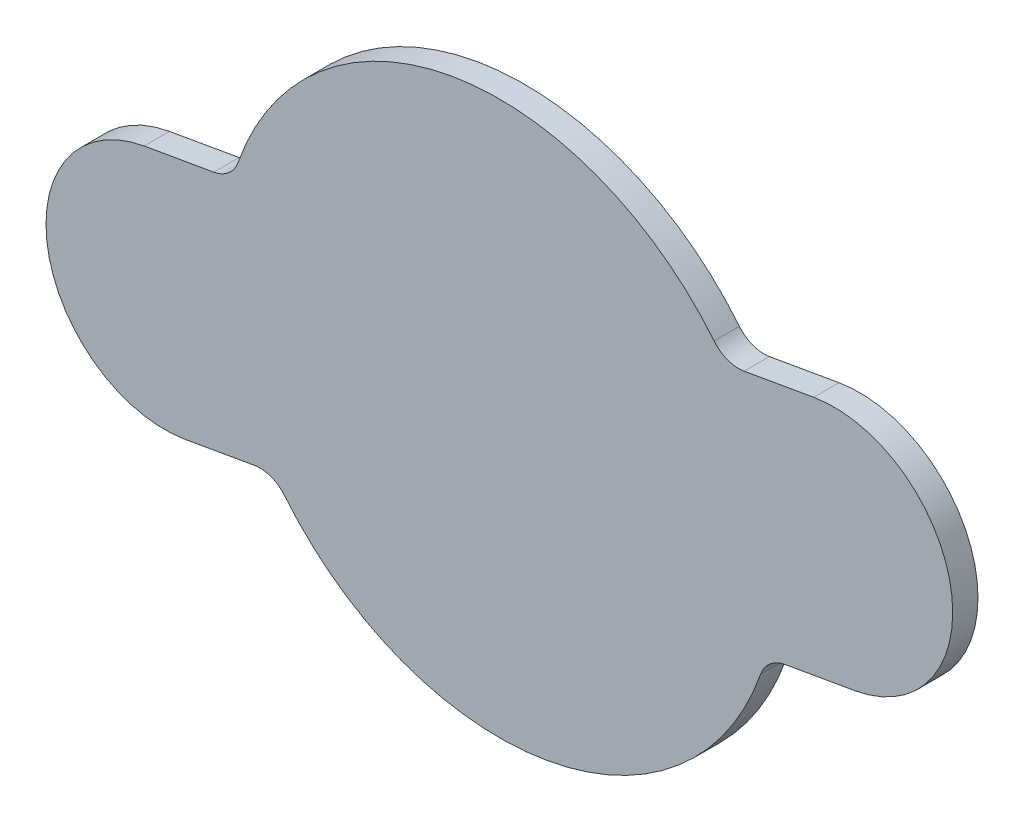
ISO-10303-21;
HEADER;
FILE_DESCRIPTION(('STEP AP214'),'2;1');
FILE_NAME('part.step','',(''),(''),'','','');
FILE_SCHEMA(('AUTOMOTIVE_DESIGN { 1 0 10303 214 1 1 1 1 }'));
ENDSEC;
DATA;
#1=APPLICATION_CONTEXT('core data for automotive mechanical design processes');
#2=APPLICATION_PROTOCOL_DEFINITION('international standard','automotive_design',2000,#1);
#3=PRODUCT_CONTEXT('',#1,'mechanical');
#4=PRODUCT('Part','Part','',(#3));
#5=PRODUCT_RELATED_PRODUCT_CATEGORY('part','',(#4));
#6=PRODUCT_DEFINITION_FORMATION('','',#4);
#7=PRODUCT_DEFINITION_CONTEXT('part definition',#1,'design');
#8=PRODUCT_DEFINITION('design','',#6,#7);
#9=PRODUCT_DEFINITION_SHAPE('','',#8);
#10=(LENGTH_UNIT() NAMED_UNIT(*) SI_UNIT(.MILLI.,.METRE.));
#11=(NAMED_UNIT(*) PLANE_ANGLE_UNIT() SI_UNIT($,.RADIAN.));
#12=(NAMED_UNIT(*) SI_UNIT($,.STERADIAN.) SOLID_ANGLE_UNIT());
#13=UNCERTAINTY_MEASURE_WITH_UNIT(LENGTH_MEASURE(1.E-05),#10,'distance_accuracy_value','');
#14=(GEOMETRIC_REPRESENTATION_CONTEXT(3) GLOBAL_UNCERTAINTY_ASSIGNED_CONTEXT((#13)) GLOBAL_UNIT_ASSIGNED_CONTEXT((#10,
#11,#12)) REPRESENTATION_CONTEXT('',''));
#15=CARTESIAN_POINT('',(0.,0.,0.));
#16=DIRECTION('',(0.,0.,1.));
#17=DIRECTION('',(1.,0.,0.));
#18=AXIS2_PLACEMENT_3D('',#15,#16,#17);
#19=CARTESIAN_POINT('',(18.8794931820799,-5.07061982227756,1.6));
#20=DIRECTION('',(0.,0.,-1.));
#21=DIRECTION('',(-1.,0.,0.));
#22=AXIS2_PLACEMENT_3D('',#19,#20,#21);
#23=CYLINDRICAL_SURFACE('',#22,2.);
#24=CARTESIAN_POINT('',(18.8794931820799,-5.07061982227756,0.));
#25=DIRECTION('',(0.,0.,-1.));
#26=DIRECTION('',(1.,0.,0.));
#27=AXIS2_PLACEMENT_3D('',#24,#25,#26);
#28=CIRCLE('',#27,2.);
#29=CARTESIAN_POINT('',(16.9910803574148,-4.41191123447826,0.));
#30=VERTEX_POINT('',#29);
#31=CARTESIAN_POINT('',(18.5347486287399,-3.10055606875525,0.));
#32=VERTEX_POINT('',#31);
#33=EDGE_CURVE('E153',#30,#32,#28,.T.);
#34=ORIENTED_EDGE('',*,*,#33,.T.);
#35=DIRECTION('',(0.,0.,-1.));
#36=VECTOR('',#35,1.);
#37=CARTESIAN_POINT('',(18.5347486287399,-3.10055606875525,1.6));
#38=LINE('',#37,#36);
#39=CARTESIAN_POINT('',(18.5347486287399,-3.10055606875525,1.6));
#40=VERTEX_POINT('',#39);
#41=EDGE_CURVE('E11',#40,#32,#38,.T.);
#42=ORIENTED_EDGE('',*,*,#41,.F.);
#43=CARTESIAN_POINT('',(18.8794931820799,-5.07061982227756,1.6));
#44=DIRECTION('',(0.,0.,-1.));
#45=DIRECTION('',(1.,0.,0.));
#46=AXIS2_PLACEMENT_3D('',#43,#44,#45);
#47=CIRCLE('',#46,2.);
#48=CARTESIAN_POINT('',(16.9910803574148,-4.41191123447826,1.6));
#49=VERTEX_POINT('',#48);
#50=EDGE_CURVE('E175',#49,#40,#47,.T.);
#51=ORIENTED_EDGE('',*,*,#50,.F.);
#52=DIRECTION('',(0.,0.,-1.));
#53=VECTOR('',#52,1.);
#54=CARTESIAN_POINT('',(16.9910803574148,-4.41191123447826,1.6));
#55=LINE('',#54,#53);
#56=EDGE_CURVE('E149',#49,#30,#55,.T.);
#57=ORIENTED_EDGE('',*,*,#56,.T.);
#58=EDGE_LOOP('',(#34,#42,#51,#57));
#59=FACE_BOUND('',#58,.T.);
#60=ADVANCED_FACE('F33',(#59),#23,.F.);
#61=CARTESIAN_POINT('',(18.5347486287399,-3.10055606875525,1.6));
#62=DIRECTION('',(-0.172372276669998,0.985031876761154,0.));
#63=DIRECTION('',(-0.985031876761154,-0.172372276669998,0.));
#64=AXIS2_PLACEMENT_3D('',#61,#62,#63);
#65=PLANE('',#64);
#66=DIRECTION('',(0.985031876761154,0.172372276669998,0.));
#67=VECTOR('',#66,1.);
#68=CARTESIAN_POINT('',(18.5347486287399,-3.10055606875525,0.));
#69=LINE('',#68,#67);
#70=CARTESIAN_POINT('',(22.9384455669854,-2.32994621853805,0.));
#71=VERTEX_POINT('',#70);
#72=EDGE_CURVE('E156',#32,#71,#69,.T.);
#73=ORIENTED_EDGE('',*,*,#72,.T.);
#74=DIRECTION('',(0.,0.,-1.));
#75=VECTOR('',#74,1.);
#76=CARTESIAN_POINT('',(22.9384455669854,-2.32994621853805,1.6));
#77=LINE('',#76,#75);
#78=CARTESIAN_POINT('',(22.9384455669854,-2.32994621853805,1.6));
#79=VERTEX_POINT('',#78);
#80=EDGE_CURVE('E41',#79,#71,#77,.T.);
#81=ORIENTED_EDGE('',*,*,#80,.F.);
#82=DIRECTION('',(0.985031876761154,0.172372276669998,0.));
#83=VECTOR('',#82,1.);
#84=CARTESIAN_POINT('',(18.5347486287399,-3.10055606875525,1.6));
#85=LINE('',#84,#83);
#86=EDGE_CURVE('E104',#40,#79,#85,.T.);
#87=ORIENTED_EDGE('',*,*,#86,.F.);
#88=ORIENTED_EDGE('',*,*,#41,.T.);
#89=EDGE_LOOP('',(#73,#81,#87,#88));
#90=FACE_BOUND('',#89,.T.);
#91=ADVANCED_FACE('F253',(#90),#65,.F.);
#92=CARTESIAN_POINT('',(21.6456534919604,5.05779285717059,1.6));
#93=DIRECTION('',(0.,0.,-1.));
#94=DIRECTION('',(-1.,0.,0.));
#95=AXIS2_PLACEMENT_3D('',#92,#93,#94);
#96=CYLINDRICAL_SURFACE('',#95,7.49999999999999);
#97=CARTESIAN_POINT('',(21.6456534919604,5.05779285717059,0.));
#98=DIRECTION('',(0.,0.,1.));
#99=DIRECTION('',(1.,0.,0.));
#100=AXIS2_PLACEMENT_3D('',#97,#98,#99);
#101=CIRCLE('',#100,7.49999999999999);
#102=CARTESIAN_POINT('',(20.3528614169354,12.4455319328792,0.));
#103=VERTEX_POINT('',#102);
#104=EDGE_CURVE('E158',#71,#103,#101,.T.);
#105=ORIENTED_EDGE('',*,*,#104,.T.);
#106=DIRECTION('',(0.,0.,-1.));
#107=VECTOR('',#106,1.);
#108=CARTESIAN_POINT('',(20.3528614169354,12.4455319328792,1.6));
#109=LINE('',#108,#107);
#110=CARTESIAN_POINT('',(20.3528614169354,12.4455319328792,1.6));
#111=VERTEX_POINT('',#110);
#112=EDGE_CURVE('E194',#111,#103,#109,.T.);
#113=ORIENTED_EDGE('',*,*,#112,.F.);
#114=CARTESIAN_POINT('',(21.6456534919604,5.05779285717059,1.6));
#115=DIRECTION('',(0.,0.,1.));
#116=DIRECTION('',(1.,0.,0.));
#117=AXIS2_PLACEMENT_3D('',#114,#115,#116);
#118=CIRCLE('',#117,7.49999999999999);
#119=EDGE_CURVE('E202',#79,#111,#118,.T.);
#120=ORIENTED_EDGE('',*,*,#119,.F.);
#121=ORIENTED_EDGE('',*,*,#80,.T.);
#122=EDGE_LOOP('',(#105,#113,#120,#121));
#123=FACE_BOUND('',#122,.T.);
#124=ADVANCED_FACE('F200',(#123),#96,.T.);
#125=CARTESIAN_POINT('',(15.9491644786899,11.6749220826621,1.6));
#126=DIRECTION('',(0.172372276669998,-0.985031876761154,0.));
#127=DIRECTION('',(0.985031876761154,0.172372276669998,0.));
#128=AXIS2_PLACEMENT_3D('',#125,#126,#127);
#129=PLANE('',#128);
#130=DIRECTION('',(-0.985031876761154,-0.172372276669998,0.));
#131=VECTOR('',#130,1.);
#132=CARTESIAN_POINT('',(15.9491644786899,11.6749220826621,0.));
#133=LINE('',#132,#131);
#134=CARTESIAN_POINT('',(15.9491644786899,11.6749220826621,0.));
#135=VERTEX_POINT('',#134);
#136=EDGE_CURVE('E160',#103,#135,#133,.T.);
#137=ORIENTED_EDGE('',*,*,#136,.T.);
#138=DIRECTION('',(0.,0.,-1.));
#139=VECTOR('',#138,1.);
#140=CARTESIAN_POINT('',(15.9491644786899,11.6749220826621,1.6));
#141=LINE('',#140,#139);
#142=CARTESIAN_POINT('',(15.9491644786899,11.6749220826621,1.6));
#143=VERTEX_POINT('',#142);
#144=EDGE_CURVE('E191',#143,#135,#141,.T.);
#145=ORIENTED_EDGE('',*,*,#144,.F.);
#146=DIRECTION('',(-0.985031876761154,-0.172372276669998,0.));
#147=VECTOR('',#146,1.);
#148=CARTESIAN_POINT('',(15.9491644786899,11.6749220826621,1.6));
#149=LINE('',#148,#147);
#150=EDGE_CURVE('E220',#111,#143,#149,.T.);
#151=ORIENTED_EDGE('',*,*,#150,.F.);
#152=ORIENTED_EDGE('',*,*,#112,.T.);
#153=EDGE_LOOP('',(#137,#145,#151,#152));
#154=FACE_BOUND('',#153,.T.);
#155=ADVANCED_FACE('F211',(#154),#129,.F.);
#156=CARTESIAN_POINT('',(15.6044199253499,13.6449858361844,1.6));
#157=DIRECTION('',(0.,0.,-1.));
#158=DIRECTION('',(-1.,0.,0.));
#159=AXIS2_PLACEMENT_3D('',#156,#157,#158);
#160=CYLINDRICAL_SURFACE('',#159,2.);
#161=CARTESIAN_POINT('',(15.6044199253499,13.6449858361844,0.));
#162=DIRECTION('',(0.,0.,-1.));
#163=DIRECTION('',(1.,0.,0.));
#164=AXIS2_PLACEMENT_3D('',#161,#162,#163);
#165=CIRCLE('',#164,2.);
#166=CARTESIAN_POINT('',(14.0519120500931,12.3841451256799,0.));
#167=VERTEX_POINT('',#166);
#168=EDGE_CURVE('E162',#135,#167,#165,.T.);
#169=ORIENTED_EDGE('',*,*,#168,.T.);
#170=DIRECTION('',(0.,0.,-1.));
#171=VECTOR('',#170,1.);
#172=CARTESIAN_POINT('',(14.0519120500931,12.3841451256799,1.6));
#173=LINE('',#172,#171);
#174=CARTESIAN_POINT('',(14.0519120500931,12.3841451256799,1.6));
#175=VERTEX_POINT('',#174);
#176=EDGE_CURVE('E188',#175,#167,#173,.T.);
#177=ORIENTED_EDGE('',*,*,#176,.F.);
#178=CARTESIAN_POINT('',(15.6044199253499,13.6449858361844,1.6));
#179=DIRECTION('',(0.,0.,-1.));
#180=DIRECTION('',(1.,0.,0.));
#181=AXIS2_PLACEMENT_3D('',#178,#179,#180);
#182=CIRCLE('',#181,2.);
#183=EDGE_CURVE('E217',#143,#175,#182,.T.);
#184=ORIENTED_EDGE('',*,*,#183,.F.);
#185=ORIENTED_EDGE('',*,*,#144,.T.);
#186=EDGE_LOOP('',(#169,#177,#184,#185));
#187=FACE_BOUND('',#186,.T.);
#188=ADVANCED_FACE('F215',(#187),#160,.F.);
#189=CARTESIAN_POINT('',(0.467468141595605,1.35178890876565,1.6));
#190=DIRECTION('',(0.,0.,-1.));
#191=DIRECTION('',(-1.,0.,0.));
#192=AXIS2_PLACEMENT_3D('',#189,#190,#191);
#193=CYLINDRICAL_SURFACE('',#192,17.5);
#194=CARTESIAN_POINT('',(0.467468141595605,1.35178890876565,0.));
#195=DIRECTION('',(0.,0.,1.));
#196=DIRECTION('',(1.,0.,0.));
#197=AXIS2_PLACEMENT_3D('',#194,#195,#196);
#198=CIRCLE('',#197,17.5);
#199=CARTESIAN_POINT('',(-16.0561440742236,7.11548905200956,0.));
#200=VERTEX_POINT('',#199);
#201=EDGE_CURVE('E164',#167,#200,#198,.T.);
#202=ORIENTED_EDGE('',*,*,#201,.T.);
#203=DIRECTION('',(0.,0.,-1.));
#204=VECTOR('',#203,1.);
#205=CARTESIAN_POINT('',(-16.0561440742236,7.11548905200956,1.6));
#206=LINE('',#205,#204);
#207=CARTESIAN_POINT('',(-16.0561440742236,7.11548905200956,1.6));
#208=VERTEX_POINT('',#207);
#209=EDGE_CURVE('E185',#208,#200,#206,.T.);
#210=ORIENTED_EDGE('',*,*,#209,.F.);
#211=CARTESIAN_POINT('',(0.467468141595605,1.35178890876565,1.6));
#212=DIRECTION('',(0.,0.,1.));
#213=DIRECTION('',(1.,0.,0.));
#214=AXIS2_PLACEMENT_3D('',#211,#212,#213);
#215=CIRCLE('',#214,17.5);
#216=EDGE_CURVE('E219',#175,#208,#215,.T.);
#217=ORIENTED_EDGE('',*,*,#216,.F.);
#218=ORIENTED_EDGE('',*,*,#176,.T.);
#219=EDGE_LOOP('',(#202,#210,#217,#218));
#220=FACE_BOUND('',#219,.T.);
#221=ADVANCED_FACE('F266',(#220),#193,.T.);
#222=CARTESIAN_POINT('',(-17.9445568988887,7.77419763980886,1.6));
#223=DIRECTION('',(0.,0.,-1.));
#224=DIRECTION('',(-1.,0.,0.));
#225=AXIS2_PLACEMENT_3D('',#222,#223,#224);
#226=CYLINDRICAL_SURFACE('',#225,2.);
#227=CARTESIAN_POINT('',(-17.9445568988887,7.77419763980886,0.));
#228=DIRECTION('',(0.,0.,-1.));
#229=DIRECTION('',(1.,0.,0.));
#230=AXIS2_PLACEMENT_3D('',#227,#228,#229);
#231=CIRCLE('',#230,2.);
#232=CARTESIAN_POINT('',(-17.5998123455487,5.80413388628655,0.));
#233=VERTEX_POINT('',#232);
#234=EDGE_CURVE('E166',#200,#233,#231,.T.);
#235=ORIENTED_EDGE('',*,*,#234,.T.);
#236=DIRECTION('',(0.,0.,-1.));
#237=VECTOR('',#236,1.);
#238=CARTESIAN_POINT('',(-17.5998123455487,5.80413388628655,1.6));
#239=LINE('',#238,#237);
#240=CARTESIAN_POINT('',(-17.5998123455487,5.80413388628655,1.6));
#241=VERTEX_POINT('',#240);
#242=EDGE_CURVE('E182',#241,#233,#239,.T.);
#243=ORIENTED_EDGE('',*,*,#242,.F.);
#244=CARTESIAN_POINT('',(-17.9445568988887,7.77419763980886,1.6));
#245=DIRECTION('',(0.,0.,-1.));
#246=DIRECTION('',(1.,0.,0.));
#247=AXIS2_PLACEMENT_3D('',#244,#245,#246);
#248=CIRCLE('',#247,2.);
#249=EDGE_CURVE('E222',#208,#241,#248,.T.);
#250=ORIENTED_EDGE('',*,*,#249,.F.);
#251=ORIENTED_EDGE('',*,*,#209,.T.);
#252=EDGE_LOOP('',(#235,#243,#250,#251));
#253=FACE_BOUND('',#252,.T.);
#254=ADVANCED_FACE('F269',(#253),#226,.F.);
#255=CARTESIAN_POINT('',(-22.0035092837942,5.03352403606935,1.6));
#256=DIRECTION('',(0.172372276669997,-0.985031876761154,0.));
#257=DIRECTION('',(0.985031876761154,0.172372276669997,0.));
#258=AXIS2_PLACEMENT_3D('',#255,#256,#257);
#259=PLANE('',#258);
#260=DIRECTION('',(-0.985031876761154,-0.172372276669997,0.));
#261=VECTOR('',#260,1.);
#262=CARTESIAN_POINT('',(-22.0035092837942,5.03352403606935,0.));
#263=LINE('',#262,#261);
#264=CARTESIAN_POINT('',(-22.0035092837942,5.03352403606935,0.));
#265=VERTEX_POINT('',#264);
#266=EDGE_CURVE('E168',#233,#265,#263,.T.);
#267=ORIENTED_EDGE('',*,*,#266,.T.);
#268=DIRECTION('',(0.,0.,-1.));
#269=VECTOR('',#268,1.);
#270=CARTESIAN_POINT('',(-22.0035092837942,5.03352403606935,1.6));
#271=LINE('',#270,#269);
#272=CARTESIAN_POINT('',(-22.0035092837942,5.03352403606935,1.6));
#273=VERTEX_POINT('',#272);
#274=EDGE_CURVE('E179',#273,#265,#271,.T.);
#275=ORIENTED_EDGE('',*,*,#274,.F.);
#276=DIRECTION('',(-0.985031876761154,-0.172372276669997,0.));
#277=VECTOR('',#276,1.);
#278=CARTESIAN_POINT('',(-22.0035092837942,5.03352403606935,1.6));
#279=LINE('',#278,#277);
#280=EDGE_CURVE('E228',#241,#273,#279,.T.);
#281=ORIENTED_EDGE('',*,*,#280,.F.);
#282=ORIENTED_EDGE('',*,*,#242,.T.);
#283=EDGE_LOOP('',(#267,#275,#281,#282));
#284=FACE_BOUND('',#283,.T.);
#285=ADVANCED_FACE('F234',(#284),#259,.F.);
#286=CARTESIAN_POINT('',(-20.7107172087692,-2.3542150396393,1.6));
#287=DIRECTION('',(0.,0.,-1.));
#288=DIRECTION('',(-1.,0.,0.));
#289=AXIS2_PLACEMENT_3D('',#286,#287,#288);
#290=CYLINDRICAL_SURFACE('',#289,7.5);
#291=CARTESIAN_POINT('',(-20.7107172087692,-2.3542150396393,0.));
#292=DIRECTION('',(0.,0.,1.));
#293=DIRECTION('',(1.,0.,0.));
#294=AXIS2_PLACEMENT_3D('',#291,#292,#293);
#295=CIRCLE('',#294,7.5);
#296=CARTESIAN_POINT('',(-19.4179251337443,-9.74195411534795,0.));
#297=VERTEX_POINT('',#296);
#298=EDGE_CURVE('E170',#265,#297,#295,.T.);
#299=ORIENTED_EDGE('',*,*,#298,.T.);
#300=DIRECTION('',(0.,0.,-1.));
#301=VECTOR('',#300,1.);
#302=CARTESIAN_POINT('',(-19.4179251337443,-9.74195411534795,1.6));
#303=LINE('',#302,#301);
#304=CARTESIAN_POINT('',(-19.4179251337443,-9.74195411534795,1.6));
#305=VERTEX_POINT('',#304);
#306=EDGE_CURVE('E144',#305,#297,#303,.T.);
#307=ORIENTED_EDGE('',*,*,#306,.F.);
#308=CARTESIAN_POINT('',(-20.7107172087692,-2.3542150396393,1.6));
#309=DIRECTION('',(0.,0.,1.));
#310=DIRECTION('',(1.,0.,0.));
#311=AXIS2_PLACEMENT_3D('',#308,#309,#310);
#312=CIRCLE('',#311,7.5);
#313=EDGE_CURVE('E135',#273,#305,#312,.T.);
#314=ORIENTED_EDGE('',*,*,#313,.F.);
#315=ORIENTED_EDGE('',*,*,#274,.T.);
#316=EDGE_LOOP('',(#299,#307,#314,#315));
#317=FACE_BOUND('',#316,.T.);
#318=ADVANCED_FACE('F238',(#317),#290,.T.);
#319=CARTESIAN_POINT('',(-19.4179251337442,-9.74195411534796,1.6));
#320=DIRECTION('',(-0.172372276669998,0.985031876761154,0.));
#321=DIRECTION('',(-0.985031876761154,-0.172372276669998,0.));
#322=AXIS2_PLACEMENT_3D('',#319,#320,#321);
#323=PLANE('',#322);
#324=DIRECTION('',(0.985031876761154,0.172372276669998,0.));
#325=VECTOR('',#324,1.);
#326=CARTESIAN_POINT('',(-19.4179251337442,-9.74195411534796,0.));
#327=LINE('',#326,#325);
#328=CARTESIAN_POINT('',(-15.0142281954987,-8.97134426513076,0.));
#329=VERTEX_POINT('',#328);
#330=EDGE_CURVE('E143',#297,#329,#327,.T.);
#331=ORIENTED_EDGE('',*,*,#330,.T.);
#332=DIRECTION('',(0.,0.,-1.));
#333=VECTOR('',#332,1.);
#334=CARTESIAN_POINT('',(-15.0142281954987,-8.97134426513076,1.6));
#335=LINE('',#334,#333);
#336=CARTESIAN_POINT('',(-15.0142281954987,-8.97134426513076,1.6));
#337=VERTEX_POINT('',#336);
#338=EDGE_CURVE('E140',#337,#329,#335,.T.);
#339=ORIENTED_EDGE('',*,*,#338,.F.);
#340=DIRECTION('',(0.985031876761154,0.172372276669998,0.));
#341=VECTOR('',#340,1.);
#342=CARTESIAN_POINT('',(-19.4179251337442,-9.74195411534796,1.6));
#343=LINE('',#342,#341);
#344=EDGE_CURVE('E129',#305,#337,#343,.T.);
#345=ORIENTED_EDGE('',*,*,#344,.F.);
#346=ORIENTED_EDGE('',*,*,#306,.T.);
#347=EDGE_LOOP('',(#331,#339,#345,#346));
#348=FACE_BOUND('',#347,.T.);
#349=ADVANCED_FACE('F141',(#348),#323,.F.);
#350=CARTESIAN_POINT('',(-14.6694836421587,-10.9414080186531,1.6));
#351=DIRECTION('',(0.,0.,-1.));
#352=DIRECTION('',(-1.,0.,0.));
#353=AXIS2_PLACEMENT_3D('',#350,#351,#352);
#354=CYLINDRICAL_SURFACE('',#353,2.00000000000001);
#355=CARTESIAN_POINT('',(-14.6694836421587,-10.9414080186531,0.));
#356=DIRECTION('',(0.,0.,-1.));
#357=DIRECTION('',(1.,0.,0.));
#358=AXIS2_PLACEMENT_3D('',#355,#356,#357);
#359=CIRCLE('',#358,2.00000000000001);
#360=CARTESIAN_POINT('',(-13.1169757669019,-9.68056730814857,0.));
#361=VERTEX_POINT('',#360);
#362=EDGE_CURVE('E90',#329,#361,#359,.T.);
#363=ORIENTED_EDGE('',*,*,#362,.T.);
#364=DIRECTION('',(0.,0.,-1.));
#365=VECTOR('',#364,1.);
#366=CARTESIAN_POINT('',(-13.1169757669019,-9.68056730814857,1.6));
#367=LINE('',#366,#365);
#368=CARTESIAN_POINT('',(-13.1169757669019,-9.68056730814857,1.6));
#369=VERTEX_POINT('',#368);
#370=EDGE_CURVE('E145',#369,#361,#367,.T.);
#371=ORIENTED_EDGE('',*,*,#370,.F.);
#372=CARTESIAN_POINT('',(-14.6694836421587,-10.9414080186531,1.6));
#373=DIRECTION('',(0.,0.,-1.));
#374=DIRECTION('',(1.,0.,0.));
#375=AXIS2_PLACEMENT_3D('',#372,#373,#374);
#376=CIRCLE('',#375,2.00000000000001);
#377=EDGE_CURVE('E133',#337,#369,#376,.T.);
#378=ORIENTED_EDGE('',*,*,#377,.F.);
#379=ORIENTED_EDGE('',*,*,#338,.T.);
#380=EDGE_LOOP('',(#363,#371,#378,#379));
#381=FACE_BOUND('',#380,.T.);
#382=ADVANCED_FACE('F147',(#381),#354,.F.);
#383=CARTESIAN_POINT('',(0.467468141595605,1.35178890876565,1.6));
#384=DIRECTION('',(0.,0.,-1.));
#385=DIRECTION('',(-1.,0.,0.));
#386=AXIS2_PLACEMENT_3D('',#383,#384,#385);
#387=CYLINDRICAL_SURFACE('',#386,17.5);
#388=CARTESIAN_POINT('',(0.467468141595605,1.35178890876565,0.));
#389=DIRECTION('',(0.,0.,1.));
#390=DIRECTION('',(1.,0.,0.));
#391=AXIS2_PLACEMENT_3D('',#388,#389,#390);
#392=CIRCLE('',#391,17.5);
#393=EDGE_CURVE('E96',#361,#30,#392,.T.);
#394=ORIENTED_EDGE('',*,*,#393,.T.);
#395=ORIENTED_EDGE('',*,*,#56,.F.);
#396=CARTESIAN_POINT('',(0.467468141595605,1.35178890876565,1.6));
#397=DIRECTION('',(0.,0.,1.));
#398=DIRECTION('',(1.,0.,0.));
#399=AXIS2_PLACEMENT_3D('',#396,#397,#398);
#400=CIRCLE('',#399,17.5);
#401=EDGE_CURVE('E49',#369,#49,#400,.T.);
#402=ORIENTED_EDGE('',*,*,#401,.F.);
#403=ORIENTED_EDGE('',*,*,#370,.T.);
#404=EDGE_LOOP('',(#394,#395,#402,#403));
#405=FACE_BOUND('',#404,.T.);
#406=ADVANCED_FACE('F242',(#405),#387,.T.);
#407=CARTESIAN_POINT('',(18.8794931820799,-5.07061982227756,1.6));
#408=DIRECTION('',(0.,0.,1.));
#409=DIRECTION('',(1.,0.,0.));
#410=AXIS2_PLACEMENT_3D('',#407,#408,#409);
#411=PLANE('',#410);
#412=ORIENTED_EDGE('',*,*,#50,.T.);
#413=ORIENTED_EDGE('',*,*,#86,.T.);
#414=ORIENTED_EDGE('',*,*,#119,.T.);
#415=ORIENTED_EDGE('',*,*,#150,.T.);
#416=ORIENTED_EDGE('',*,*,#183,.T.);
#417=ORIENTED_EDGE('',*,*,#216,.T.);
#418=ORIENTED_EDGE('',*,*,#249,.T.);
#419=ORIENTED_EDGE('',*,*,#280,.T.);
#420=ORIENTED_EDGE('',*,*,#313,.T.);
#421=ORIENTED_EDGE('',*,*,#344,.T.);
#422=ORIENTED_EDGE('',*,*,#377,.T.);
#423=ORIENTED_EDGE('',*,*,#401,.T.);
#424=EDGE_LOOP('',(#412,#413,#414,#415,#416,#417,#418,#419,#420,#421,#422,#423));
#425=FACE_BOUND('',#424,.T.);
#426=ADVANCED_FACE('F131',(#425),#411,.T.);
#427=CARTESIAN_POINT('',(18.8794931820799,-5.07061982227756,0.));
#428=DIRECTION('',(0.,0.,1.));
#429=DIRECTION('',(1.,0.,0.));
#430=AXIS2_PLACEMENT_3D('',#427,#428,#429);
#431=PLANE('',#430);
#432=ORIENTED_EDGE('',*,*,#33,.F.);
#433=ORIENTED_EDGE('',*,*,#393,.F.);
#434=ORIENTED_EDGE('',*,*,#362,.F.);
#435=ORIENTED_EDGE('',*,*,#330,.F.);
#436=ORIENTED_EDGE('',*,*,#298,.F.);
#437=ORIENTED_EDGE('',*,*,#266,.F.);
#438=ORIENTED_EDGE('',*,*,#234,.F.);
#439=ORIENTED_EDGE('',*,*,#201,.F.);
#440=ORIENTED_EDGE('',*,*,#168,.F.);
#441=ORIENTED_EDGE('',*,*,#136,.F.);
#442=ORIENTED_EDGE('',*,*,#104,.F.);
#443=ORIENTED_EDGE('',*,*,#72,.F.);
#444=EDGE_LOOP('',(#432,#433,#434,#435,#436,#437,#438,#439,#440,#441,#442,#443));
#445=FACE_BOUND('',#444,.T.);
#446=ADVANCED_FACE('F206',(#445),#431,.F.);
#447=CLOSED_SHELL('',(#60,#91,#124,#155,#188,#221,#254,#285,#318,#349,#382,#406,#426,#446));
#448=MANIFOLD_SOLID_BREP('B2',#447);
#449=ADVANCED_BREP_SHAPE_REPRESENTATION('',(#18,#448),#14);
#450=SHAPE_DEFINITION_REPRESENTATION(#9,#449);
ENDSEC;
END-ISO-10303-21;
